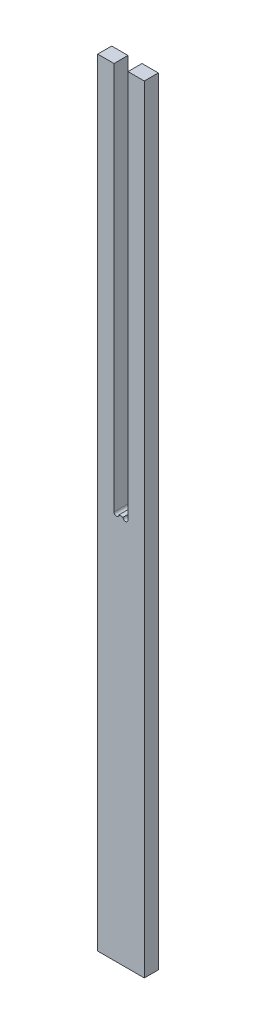
ISO-10303-21;
HEADER;
FILE_DESCRIPTION(('STEP AP214'),'2;1');
FILE_NAME('part.step','',(''),(''),'','','');
FILE_SCHEMA(('AUTOMOTIVE_DESIGN { 1 0 10303 214 1 1 1 1 }'));
ENDSEC;
DATA;
#1=APPLICATION_CONTEXT('core data for automotive mechanical design processes');
#2=APPLICATION_PROTOCOL_DEFINITION('international standard','automotive_design',2000,#1);
#3=PRODUCT_CONTEXT('',#1,'mechanical');
#4=PRODUCT('Part','Part','',(#3));
#5=PRODUCT_RELATED_PRODUCT_CATEGORY('part','',(#4));
#6=PRODUCT_DEFINITION_FORMATION('','',#4);
#7=PRODUCT_DEFINITION_CONTEXT('part definition',#1,'design');
#8=PRODUCT_DEFINITION('design','',#6,#7);
#9=PRODUCT_DEFINITION_SHAPE('','',#8);
#10=(LENGTH_UNIT() NAMED_UNIT(*) SI_UNIT(.MILLI.,.METRE.));
#11=(NAMED_UNIT(*) PLANE_ANGLE_UNIT() SI_UNIT($,.RADIAN.));
#12=(NAMED_UNIT(*) SI_UNIT($,.STERADIAN.) SOLID_ANGLE_UNIT());
#13=UNCERTAINTY_MEASURE_WITH_UNIT(LENGTH_MEASURE(1.E-05),#10,'distance_accuracy_value','');
#14=(GEOMETRIC_REPRESENTATION_CONTEXT(3) GLOBAL_UNCERTAINTY_ASSIGNED_CONTEXT((#13)) GLOBAL_UNIT_ASSIGNED_CONTEXT((#10,
#11,#12)) REPRESENTATION_CONTEXT('',''));
#15=CARTESIAN_POINT('',(0.,0.,0.));
#16=DIRECTION('',(0.,0.,1.));
#17=DIRECTION('',(1.,0.,0.));
#18=AXIS2_PLACEMENT_3D('',#15,#16,#17);
#19=CARTESIAN_POINT('',(-33.2222222222223,825.,18.));
#20=DIRECTION('',(0.,1.,0.));
#21=DIRECTION('',(0.,0.,1.));
#22=AXIS2_PLACEMENT_3D('',#19,#20,#21);
#23=PLANE('',#22);
#24=DIRECTION('',(1.,0.,0.));
#25=VECTOR('',#24,1.);
#26=CARTESIAN_POINT('',(-33.2222222222223,825.,0.));
#27=LINE('',#26,#25);
#28=CARTESIAN_POINT('',(-33.2222222222223,825.,0.));
#29=VERTEX_POINT('',#28);
#30=CARTESIAN_POINT('',(-12.2222222222223,825.,0.));
#31=VERTEX_POINT('',#30);
#32=EDGE_CURVE('E142',#29,#31,#27,.T.);
#33=ORIENTED_EDGE('',*,*,#32,.F.);
#34=DIRECTION('',(0.,0.,-1.));
#35=VECTOR('',#34,1.);
#36=CARTESIAN_POINT('',(-33.2222222222223,825.,18.));
#37=LINE('',#36,#35);
#38=CARTESIAN_POINT('',(-33.2222222222223,825.,18.));
#39=VERTEX_POINT('',#38);
#40=EDGE_CURVE('E11',#39,#29,#37,.T.);
#41=ORIENTED_EDGE('',*,*,#40,.F.);
#42=DIRECTION('',(1.,0.,0.));
#43=VECTOR('',#42,1.);
#44=CARTESIAN_POINT('',(-33.2222222222223,825.,18.));
#45=LINE('',#44,#43);
#46=CARTESIAN_POINT('',(-12.2222222222223,825.,18.));
#47=VERTEX_POINT('',#46);
#48=EDGE_CURVE('E167',#39,#47,#45,.T.);
#49=ORIENTED_EDGE('',*,*,#48,.T.);
#50=DIRECTION('',(0.,0.,-1.));
#51=VECTOR('',#50,1.);
#52=CARTESIAN_POINT('',(-12.2222222222223,825.,18.));
#53=LINE('',#52,#51);
#54=EDGE_CURVE('E36',#47,#31,#53,.T.);
#55=ORIENTED_EDGE('',*,*,#54,.T.);
#56=EDGE_LOOP('',(#33,#41,#49,#55));
#57=FACE_BOUND('',#56,.T.);
#58=ADVANCED_FACE('F33',(#57),#23,.T.);
#59=CARTESIAN_POINT('',(-33.2222222222223,325.,18.));
#60=DIRECTION('',(-1.,0.,0.));
#61=DIRECTION('',(0.,0.,1.));
#62=AXIS2_PLACEMENT_3D('',#59,#60,#61);
#63=PLANE('',#62);
#64=DIRECTION('',(0.,1.,0.));
#65=VECTOR('',#64,1.);
#66=CARTESIAN_POINT('',(-33.2222222222223,325.,0.));
#67=LINE('',#66,#65);
#68=CARTESIAN_POINT('',(-33.2222222222223,325.,0.));
#69=VERTEX_POINT('',#68);
#70=EDGE_CURVE('E165',#69,#29,#67,.T.);
#71=ORIENTED_EDGE('',*,*,#70,.F.);
#72=DIRECTION('',(0.,0.,-1.));
#73=VECTOR('',#72,1.);
#74=CARTESIAN_POINT('',(-33.2222222222223,325.,18.));
#75=LINE('',#74,#73);
#76=CARTESIAN_POINT('',(-33.2222222222223,325.,18.));
#77=VERTEX_POINT('',#76);
#78=EDGE_CURVE('E42',#77,#69,#75,.T.);
#79=ORIENTED_EDGE('',*,*,#78,.F.);
#80=DIRECTION('',(0.,1.,0.));
#81=VECTOR('',#80,1.);
#82=CARTESIAN_POINT('',(-33.2222222222223,325.,18.));
#83=LINE('',#82,#81);
#84=EDGE_CURVE('E124',#77,#39,#83,.T.);
#85=ORIENTED_EDGE('',*,*,#84,.T.);
#86=ORIENTED_EDGE('',*,*,#40,.T.);
#87=EDGE_LOOP('',(#71,#79,#85,#86));
#88=FACE_BOUND('',#87,.T.);
#89=ADVANCED_FACE('F185',(#88),#63,.T.);
#90=CARTESIAN_POINT('',(-36.3972222222223,325.,18.));
#91=DIRECTION('',(0.,0.,-1.));
#92=DIRECTION('',(-1.,0.,0.));
#93=AXIS2_PLACEMENT_3D('',#90,#91,#92);
#94=CYLINDRICAL_SURFACE('',#93,3.175);
#95=CARTESIAN_POINT('',(-36.3972222222223,325.,0.));
#96=DIRECTION('',(0.,0.,-1.));
#97=DIRECTION('',(-1.,0.,0.));
#98=AXIS2_PLACEMENT_3D('',#95,#96,#97);
#99=CIRCLE('',#98,3.175);
#100=CARTESIAN_POINT('',(-39.5722222222223,325.,0.));
#101=VERTEX_POINT('',#100);
#102=EDGE_CURVE('E128',#69,#101,#99,.T.);
#103=ORIENTED_EDGE('',*,*,#102,.T.);
#104=DIRECTION('',(0.,0.,-1.));
#105=VECTOR('',#104,1.);
#106=CARTESIAN_POINT('',(-39.5722222222223,325.,18.));
#107=LINE('',#106,#105);
#108=CARTESIAN_POINT('',(-39.5722222222223,325.,18.));
#109=VERTEX_POINT('',#108);
#110=EDGE_CURVE('E126',#109,#101,#107,.T.);
#111=ORIENTED_EDGE('',*,*,#110,.F.);
#112=CARTESIAN_POINT('',(-36.3972222222223,325.,18.));
#113=DIRECTION('',(0.,0.,-1.));
#114=DIRECTION('',(-1.,0.,0.));
#115=AXIS2_PLACEMENT_3D('',#112,#113,#114);
#116=CIRCLE('',#115,3.175);
#117=EDGE_CURVE('E117',#77,#109,#116,.T.);
#118=ORIENTED_EDGE('',*,*,#117,.F.);
#119=ORIENTED_EDGE('',*,*,#78,.T.);
#120=EDGE_LOOP('',(#103,#111,#118,#119));
#121=FACE_BOUND('',#120,.T.);
#122=ADVANCED_FACE('F127',(#121),#94,.F.);
#123=CARTESIAN_POINT('',(-44.8722222222223,325.,18.));
#124=DIRECTION('',(0.,1.,0.));
#125=DIRECTION('',(0.,0.,1.));
#126=AXIS2_PLACEMENT_3D('',#123,#124,#125);
#127=PLANE('',#126);
#128=DIRECTION('',(1.,0.,0.));
#129=VECTOR('',#128,1.);
#130=CARTESIAN_POINT('',(-44.8722222222223,325.,0.));
#131=LINE('',#130,#129);
#132=CARTESIAN_POINT('',(-44.8722222222223,325.,0.));
#133=VERTEX_POINT('',#132);
#134=EDGE_CURVE('E162',#133,#101,#131,.T.);
#135=ORIENTED_EDGE('',*,*,#134,.F.);
#136=DIRECTION('',(0.,0.,-1.));
#137=VECTOR('',#136,1.);
#138=CARTESIAN_POINT('',(-44.8722222222223,325.,18.));
#139=LINE('',#138,#137);
#140=CARTESIAN_POINT('',(-44.8722222222223,325.,18.));
#141=VERTEX_POINT('',#140);
#142=EDGE_CURVE('E132',#141,#133,#139,.T.);
#143=ORIENTED_EDGE('',*,*,#142,.F.);
#144=DIRECTION('',(1.,0.,0.));
#145=VECTOR('',#144,1.);
#146=CARTESIAN_POINT('',(-44.8722222222223,325.,18.));
#147=LINE('',#146,#145);
#148=EDGE_CURVE('E122',#141,#109,#147,.T.);
#149=ORIENTED_EDGE('',*,*,#148,.T.);
#150=ORIENTED_EDGE('',*,*,#110,.T.);
#151=EDGE_LOOP('',(#135,#143,#149,#150));
#152=FACE_BOUND('',#151,.T.);
#153=ADVANCED_FACE('F134',(#152),#127,.T.);
#154=CARTESIAN_POINT('',(-48.0472222222223,325.,18.));
#155=DIRECTION('',(0.,0.,-1.));
#156=DIRECTION('',(-1.,0.,0.));
#157=AXIS2_PLACEMENT_3D('',#154,#155,#156);
#158=CYLINDRICAL_SURFACE('',#157,3.175);
#159=CARTESIAN_POINT('',(-48.0472222222223,325.,0.));
#160=DIRECTION('',(0.,0.,1.));
#161=DIRECTION('',(1.,0.,0.));
#162=AXIS2_PLACEMENT_3D('',#159,#160,#161);
#163=CIRCLE('',#162,3.175);
#164=CARTESIAN_POINT('',(-51.2222222222223,325.,0.));
#165=VERTEX_POINT('',#164);
#166=EDGE_CURVE('E159',#165,#133,#163,.T.);
#167=ORIENTED_EDGE('',*,*,#166,.F.);
#168=DIRECTION('',(0.,0.,-1.));
#169=VECTOR('',#168,1.);
#170=CARTESIAN_POINT('',(-51.2222222222223,325.,18.));
#171=LINE('',#170,#169);
#172=CARTESIAN_POINT('',(-51.2222222222223,325.,18.));
#173=VERTEX_POINT('',#172);
#174=EDGE_CURVE('E171',#173,#165,#171,.T.);
#175=ORIENTED_EDGE('',*,*,#174,.F.);
#176=CARTESIAN_POINT('',(-48.0472222222223,325.,18.));
#177=DIRECTION('',(0.,0.,1.));
#178=DIRECTION('',(1.,0.,0.));
#179=AXIS2_PLACEMENT_3D('',#176,#177,#178);
#180=CIRCLE('',#179,3.175);
#181=EDGE_CURVE('E135',#173,#141,#180,.T.);
#182=ORIENTED_EDGE('',*,*,#181,.T.);
#183=ORIENTED_EDGE('',*,*,#142,.T.);
#184=EDGE_LOOP('',(#167,#175,#182,#183));
#185=FACE_BOUND('',#184,.T.);
#186=ADVANCED_FACE('F198',(#185),#158,.F.);
#187=CARTESIAN_POINT('',(-51.2222222222223,825.,18.));
#188=DIRECTION('',(1.,0.,0.));
#189=DIRECTION('',(0.,1.,0.));
#190=AXIS2_PLACEMENT_3D('',#187,#188,#189);
#191=PLANE('',#190);
#192=DIRECTION('',(0.,-1.,0.));
#193=VECTOR('',#192,1.);
#194=CARTESIAN_POINT('',(-51.2222222222223,825.,0.));
#195=LINE('',#194,#193);
#196=CARTESIAN_POINT('',(-51.2222222222223,825.,0.));
#197=VERTEX_POINT('',#196);
#198=EDGE_CURVE('E156',#197,#165,#195,.T.);
#199=ORIENTED_EDGE('',*,*,#198,.F.);
#200=DIRECTION('',(0.,0.,-1.));
#201=VECTOR('',#200,1.);
#202=CARTESIAN_POINT('',(-51.2222222222223,825.,18.));
#203=LINE('',#202,#201);
#204=CARTESIAN_POINT('',(-51.2222222222223,825.,18.));
#205=VERTEX_POINT('',#204);
#206=EDGE_CURVE('E173',#205,#197,#203,.T.);
#207=ORIENTED_EDGE('',*,*,#206,.F.);
#208=DIRECTION('',(0.,-1.,0.));
#209=VECTOR('',#208,1.);
#210=CARTESIAN_POINT('',(-51.2222222222223,825.,18.));
#211=LINE('',#210,#209);
#212=EDGE_CURVE('E137',#205,#173,#211,.T.);
#213=ORIENTED_EDGE('',*,*,#212,.T.);
#214=ORIENTED_EDGE('',*,*,#174,.T.);
#215=EDGE_LOOP('',(#199,#207,#213,#214));
#216=FACE_BOUND('',#215,.T.);
#217=ADVANCED_FACE('F201',(#216),#191,.T.);
#218=CARTESIAN_POINT('',(-72.2222222222223,825.,18.));
#219=DIRECTION('',(0.,1.,0.));
#220=DIRECTION('',(0.,0.,1.));
#221=AXIS2_PLACEMENT_3D('',#218,#219,#220);
#222=PLANE('',#221);
#223=DIRECTION('',(1.,0.,0.));
#224=VECTOR('',#223,1.);
#225=CARTESIAN_POINT('',(-72.2222222222223,825.,0.));
#226=LINE('',#225,#224);
#227=CARTESIAN_POINT('',(-72.2222222222223,825.,0.));
#228=VERTEX_POINT('',#227);
#229=EDGE_CURVE('E153',#228,#197,#226,.T.);
#230=ORIENTED_EDGE('',*,*,#229,.F.);
#231=DIRECTION('',(0.,0.,-1.));
#232=VECTOR('',#231,1.);
#233=CARTESIAN_POINT('',(-72.2222222222223,825.,18.));
#234=LINE('',#233,#232);
#235=CARTESIAN_POINT('',(-72.2222222222223,825.,18.));
#236=VERTEX_POINT('',#235);
#237=EDGE_CURVE('E175',#236,#228,#234,.T.);
#238=ORIENTED_EDGE('',*,*,#237,.F.);
#239=DIRECTION('',(1.,0.,0.));
#240=VECTOR('',#239,1.);
#241=CARTESIAN_POINT('',(-72.2222222222223,825.,18.));
#242=LINE('',#241,#240);
#243=EDGE_CURVE('E298',#236,#205,#242,.T.);
#244=ORIENTED_EDGE('',*,*,#243,.T.);
#245=ORIENTED_EDGE('',*,*,#206,.T.);
#246=EDGE_LOOP('',(#230,#238,#244,#245));
#247=FACE_BOUND('',#246,.T.);
#248=ADVANCED_FACE('F205',(#247),#222,.T.);
#249=CARTESIAN_POINT('',(-72.2222222222223,825.,18.));
#250=DIRECTION('',(1.,0.,0.));
#251=DIRECTION('',(0.,1.,0.));
#252=AXIS2_PLACEMENT_3D('',#249,#250,#251);
#253=PLANE('',#252);
#254=DIRECTION('',(0.,-1.,0.));
#255=VECTOR('',#254,1.);
#256=CARTESIAN_POINT('',(-72.2222222222223,825.,0.));
#257=LINE('',#256,#255);
#258=CARTESIAN_POINT('',(-72.2222222222222,-175.,0.));
#259=VERTEX_POINT('',#258);
#260=EDGE_CURVE('E151',#228,#259,#257,.T.);
#261=ORIENTED_EDGE('',*,*,#260,.T.);
#262=DIRECTION('',(0.,0.,-1.));
#263=VECTOR('',#262,1.);
#264=CARTESIAN_POINT('',(-72.2222222222222,-175.,18.));
#265=LINE('',#264,#263);
#266=CARTESIAN_POINT('',(-72.2222222222222,-175.,18.));
#267=VERTEX_POINT('',#266);
#268=EDGE_CURVE('E177',#267,#259,#265,.T.);
#269=ORIENTED_EDGE('',*,*,#268,.F.);
#270=DIRECTION('',(0.,-1.,0.));
#271=VECTOR('',#270,1.);
#272=CARTESIAN_POINT('',(-72.2222222222223,825.,18.));
#273=LINE('',#272,#271);
#274=EDGE_CURVE('E302',#236,#267,#273,.T.);
#275=ORIENTED_EDGE('',*,*,#274,.F.);
#276=ORIENTED_EDGE('',*,*,#237,.T.);
#277=EDGE_LOOP('',(#261,#269,#275,#276));
#278=FACE_BOUND('',#277,.T.);
#279=ADVANCED_FACE('F209',(#278),#253,.F.);
#280=CARTESIAN_POINT('',(-72.2222222222222,-175.,18.));
#281=DIRECTION('',(0.,1.,0.));
#282=DIRECTION('',(0.,0.,1.));
#283=AXIS2_PLACEMENT_3D('',#280,#281,#282);
#284=PLANE('',#283);
#285=DIRECTION('',(1.,0.,0.));
#286=VECTOR('',#285,1.);
#287=CARTESIAN_POINT('',(-72.2222222222222,-175.,0.));
#288=LINE('',#287,#286);
#289=CARTESIAN_POINT('',(-12.2222222222222,-175.,0.));
#290=VERTEX_POINT('',#289);
#291=EDGE_CURVE('E148',#259,#290,#288,.T.);
#292=ORIENTED_EDGE('',*,*,#291,.T.);
#293=DIRECTION('',(0.,0.,-1.));
#294=VECTOR('',#293,1.);
#295=CARTESIAN_POINT('',(-12.2222222222222,-175.,18.));
#296=LINE('',#295,#294);
#297=CARTESIAN_POINT('',(-12.2222222222222,-175.,18.));
#298=VERTEX_POINT('',#297);
#299=EDGE_CURVE('E179',#298,#290,#296,.T.);
#300=ORIENTED_EDGE('',*,*,#299,.F.);
#301=DIRECTION('',(1.,0.,0.));
#302=VECTOR('',#301,1.);
#303=CARTESIAN_POINT('',(-72.2222222222222,-175.,18.));
#304=LINE('',#303,#302);
#305=EDGE_CURVE('E306',#267,#298,#304,.T.);
#306=ORIENTED_EDGE('',*,*,#305,.F.);
#307=ORIENTED_EDGE('',*,*,#268,.T.);
#308=EDGE_LOOP('',(#292,#300,#306,#307));
#309=FACE_BOUND('',#308,.T.);
#310=ADVANCED_FACE('F213',(#309),#284,.F.);
#311=CARTESIAN_POINT('',(-12.2222222222223,825.,18.));
#312=DIRECTION('',(1.,0.,0.));
#313=DIRECTION('',(0.,1.,0.));
#314=AXIS2_PLACEMENT_3D('',#311,#312,#313);
#315=PLANE('',#314);
#316=DIRECTION('',(0.,-1.,0.));
#317=VECTOR('',#316,1.);
#318=CARTESIAN_POINT('',(-12.2222222222223,825.,0.));
#319=LINE('',#318,#317);
#320=EDGE_CURVE('E145',#31,#290,#319,.T.);
#321=ORIENTED_EDGE('',*,*,#320,.F.);
#322=ORIENTED_EDGE('',*,*,#54,.F.);
#323=DIRECTION('',(0.,-1.,0.));
#324=VECTOR('',#323,1.);
#325=CARTESIAN_POINT('',(-12.2222222222223,825.,18.));
#326=LINE('',#325,#324);
#327=EDGE_CURVE('E308',#47,#298,#326,.T.);
#328=ORIENTED_EDGE('',*,*,#327,.T.);
#329=ORIENTED_EDGE('',*,*,#299,.T.);
#330=EDGE_LOOP('',(#321,#322,#328,#329));
#331=FACE_BOUND('',#330,.T.);
#332=ADVANCED_FACE('F181',(#331),#315,.T.);
#333=CARTESIAN_POINT('',(-48.0472222222223,325.,18.));
#334=DIRECTION('',(0.,0.,1.));
#335=DIRECTION('',(1.,0.,0.));
#336=AXIS2_PLACEMENT_3D('',#333,#334,#335);
#337=PLANE('',#336);
#338=ORIENTED_EDGE('',*,*,#48,.F.);
#339=ORIENTED_EDGE('',*,*,#84,.F.);
#340=ORIENTED_EDGE('',*,*,#117,.T.);
#341=ORIENTED_EDGE('',*,*,#148,.F.);
#342=ORIENTED_EDGE('',*,*,#181,.F.);
#343=ORIENTED_EDGE('',*,*,#212,.F.);
#344=ORIENTED_EDGE('',*,*,#243,.F.);
#345=ORIENTED_EDGE('',*,*,#274,.T.);
#346=ORIENTED_EDGE('',*,*,#305,.T.);
#347=ORIENTED_EDGE('',*,*,#327,.F.);
#348=EDGE_LOOP('',(#338,#339,#340,#341,#342,#343,#344,#345,#346,#347));
#349=FACE_BOUND('',#348,.T.);
#350=ADVANCED_FACE('F119',(#349),#337,.T.);
#351=CARTESIAN_POINT('',(-48.0472222222223,325.,0.));
#352=DIRECTION('',(0.,0.,1.));
#353=DIRECTION('',(1.,0.,0.));
#354=AXIS2_PLACEMENT_3D('',#351,#352,#353);
#355=PLANE('',#354);
#356=ORIENTED_EDGE('',*,*,#32,.T.);
#357=ORIENTED_EDGE('',*,*,#320,.T.);
#358=ORIENTED_EDGE('',*,*,#291,.F.);
#359=ORIENTED_EDGE('',*,*,#260,.F.);
#360=ORIENTED_EDGE('',*,*,#229,.T.);
#361=ORIENTED_EDGE('',*,*,#198,.T.);
#362=ORIENTED_EDGE('',*,*,#166,.T.);
#363=ORIENTED_EDGE('',*,*,#134,.T.);
#364=ORIENTED_EDGE('',*,*,#102,.F.);
#365=ORIENTED_EDGE('',*,*,#70,.T.);
#366=EDGE_LOOP('',(#356,#357,#358,#359,#360,#361,#362,#363,#364,#365));
#367=FACE_BOUND('',#366,.T.);
#368=ADVANCED_FACE('F184',(#367),#355,.F.);
#369=CLOSED_SHELL('',(#58,#89,#122,#153,#186,#217,#248,#279,#310,#332,#350,#368));
#370=MANIFOLD_SOLID_BREP('B2',#369);
#371=ADVANCED_BREP_SHAPE_REPRESENTATION('',(#18,#370),#14);
#372=SHAPE_DEFINITION_REPRESENTATION(#9,#371);
ENDSEC;
END-ISO-10303-21;
